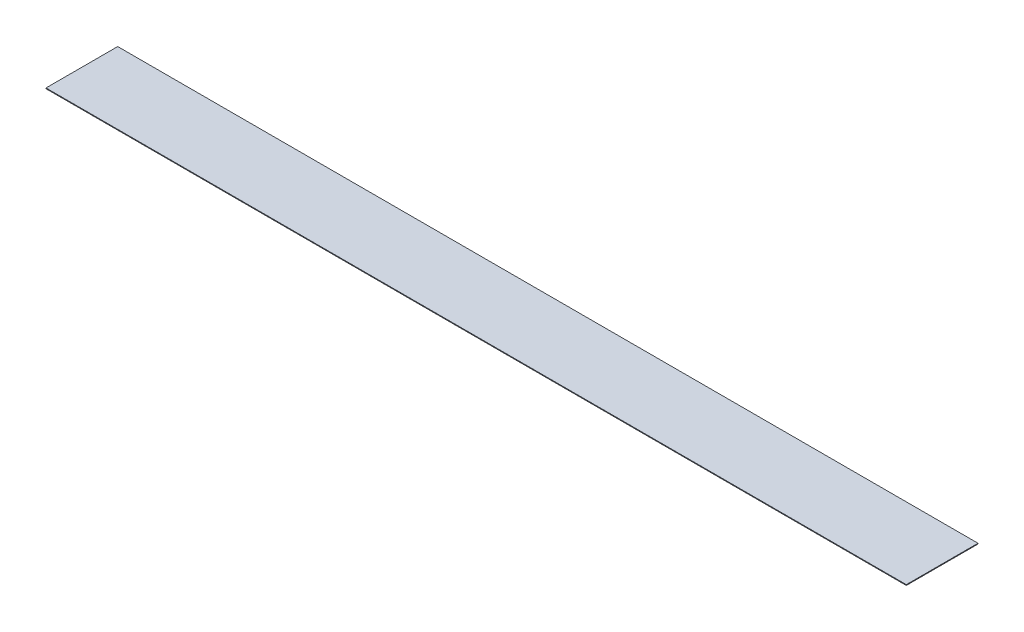
ISO-10303-21;
HEADER;
FILE_DESCRIPTION(('STEP AP214'),'2;1');
FILE_NAME('part.step','',(''),(''),'','','');
FILE_SCHEMA(('AUTOMOTIVE_DESIGN { 1 0 10303 214 1 1 1 1 }'));
ENDSEC;
DATA;
#1=APPLICATION_CONTEXT('core data for automotive mechanical design processes');
#2=APPLICATION_PROTOCOL_DEFINITION('international standard','automotive_design',2000,#1);
#3=PRODUCT_CONTEXT('',#1,'mechanical');
#4=PRODUCT('Part','Part','',(#3));
#5=PRODUCT_RELATED_PRODUCT_CATEGORY('part','',(#4));
#6=PRODUCT_DEFINITION_FORMATION('','',#4);
#7=PRODUCT_DEFINITION_CONTEXT('part definition',#1,'design');
#8=PRODUCT_DEFINITION('design','',#6,#7);
#9=PRODUCT_DEFINITION_SHAPE('','',#8);
#10=(LENGTH_UNIT() NAMED_UNIT(*) SI_UNIT(.MILLI.,.METRE.));
#11=(NAMED_UNIT(*) PLANE_ANGLE_UNIT() SI_UNIT($,.RADIAN.));
#12=(NAMED_UNIT(*) SI_UNIT($,.STERADIAN.) SOLID_ANGLE_UNIT());
#13=UNCERTAINTY_MEASURE_WITH_UNIT(LENGTH_MEASURE(1.E-05),#10,'distance_accuracy_value','');
#14=(GEOMETRIC_REPRESENTATION_CONTEXT(3) GLOBAL_UNCERTAINTY_ASSIGNED_CONTEXT((#13)) GLOBAL_UNIT_ASSIGNED_CONTEXT((#10,
#11,#12)) REPRESENTATION_CONTEXT('',''));
#15=CARTESIAN_POINT('',(0.,0.,0.));
#16=DIRECTION('',(0.,0.,1.));
#17=DIRECTION('',(1.,0.,0.));
#18=AXIS2_PLACEMENT_3D('',#15,#16,#17);
#19=CARTESIAN_POINT('',(1524.,2.54,127.));
#20=DIRECTION('',(-1.,0.,0.));
#21=DIRECTION('',(0.,0.,1.));
#22=AXIS2_PLACEMENT_3D('',#19,#20,#21);
#23=PLANE('',#22);
#24=DIRECTION('',(0.,0.,-1.));
#25=VECTOR('',#24,1.);
#26=CARTESIAN_POINT('',(1524.,0.,127.));
#27=LINE('',#26,#25);
#28=CARTESIAN_POINT('',(1524.,0.,127.));
#29=VERTEX_POINT('',#28);
#30=CARTESIAN_POINT('',(1524.,0.,-127.));
#31=VERTEX_POINT('',#30);
#32=EDGE_CURVE('E107',#29,#31,#27,.T.);
#33=ORIENTED_EDGE('',*,*,#32,.T.);
#34=DIRECTION('',(0.,-1.,0.));
#35=VECTOR('',#34,1.);
#36=CARTESIAN_POINT('',(1524.,2.54,-127.));
#37=LINE('',#36,#35);
#38=CARTESIAN_POINT('',(1524.,2.54,-127.));
#39=VERTEX_POINT('',#38);
#40=EDGE_CURVE('E11',#39,#31,#37,.T.);
#41=ORIENTED_EDGE('',*,*,#40,.F.);
#42=DIRECTION('',(0.,0.,-1.));
#43=VECTOR('',#42,1.);
#44=CARTESIAN_POINT('',(1524.,2.54,127.));
#45=LINE('',#44,#43);
#46=CARTESIAN_POINT('',(1524.,2.54,127.));
#47=VERTEX_POINT('',#46);
#48=EDGE_CURVE('E91',#47,#39,#45,.T.);
#49=ORIENTED_EDGE('',*,*,#48,.F.);
#50=DIRECTION('',(0.,-1.,0.));
#51=VECTOR('',#50,1.);
#52=CARTESIAN_POINT('',(1524.,2.54,127.));
#53=LINE('',#52,#51);
#54=EDGE_CURVE('E103',#47,#29,#53,.T.);
#55=ORIENTED_EDGE('',*,*,#54,.T.);
#56=EDGE_LOOP('',(#33,#41,#49,#55));
#57=FACE_BOUND('',#56,.T.);
#58=ADVANCED_FACE('F39',(#57),#23,.F.);
#59=CARTESIAN_POINT('',(-1524.,2.54,-127.));
#60=DIRECTION('',(0.,0.,1.));
#61=DIRECTION('',(1.,0.,0.));
#62=AXIS2_PLACEMENT_3D('',#59,#60,#61);
#63=PLANE('',#62);
#64=DIRECTION('',(-1.,0.,0.));
#65=VECTOR('',#64,1.);
#66=CARTESIAN_POINT('',(-1524.,0.,-127.));
#67=LINE('',#66,#65);
#68=CARTESIAN_POINT('',(-1524.,0.,-127.));
#69=VERTEX_POINT('',#68);
#70=EDGE_CURVE('E96',#31,#69,#67,.T.);
#71=ORIENTED_EDGE('',*,*,#70,.T.);
#72=DIRECTION('',(0.,-1.,0.));
#73=VECTOR('',#72,1.);
#74=CARTESIAN_POINT('',(-1524.,2.54,-127.));
#75=LINE('',#74,#73);
#76=CARTESIAN_POINT('',(-1524.,2.54,-127.));
#77=VERTEX_POINT('',#76);
#78=EDGE_CURVE('E48',#77,#69,#75,.T.);
#79=ORIENTED_EDGE('',*,*,#78,.F.);
#80=DIRECTION('',(-1.,0.,0.));
#81=VECTOR('',#80,1.);
#82=CARTESIAN_POINT('',(-1524.,2.54,-127.));
#83=LINE('',#82,#81);
#84=EDGE_CURVE('E86',#39,#77,#83,.T.);
#85=ORIENTED_EDGE('',*,*,#84,.F.);
#86=ORIENTED_EDGE('',*,*,#40,.T.);
#87=EDGE_LOOP('',(#71,#79,#85,#86));
#88=FACE_BOUND('',#87,.T.);
#89=ADVANCED_FACE('F95',(#88),#63,.F.);
#90=CARTESIAN_POINT('',(-1524.,2.54,127.));
#91=DIRECTION('',(1.,0.,0.));
#92=DIRECTION('',(0.,0.,-1.));
#93=AXIS2_PLACEMENT_3D('',#90,#91,#92);
#94=PLANE('',#93);
#95=DIRECTION('',(0.,0.,1.));
#96=VECTOR('',#95,1.);
#97=CARTESIAN_POINT('',(-1524.,0.,127.));
#98=LINE('',#97,#96);
#99=CARTESIAN_POINT('',(-1524.,0.,127.));
#100=VERTEX_POINT('',#99);
#101=EDGE_CURVE('E73',#69,#100,#98,.T.);
#102=ORIENTED_EDGE('',*,*,#101,.T.);
#103=DIRECTION('',(0.,-1.,0.));
#104=VECTOR('',#103,1.);
#105=CARTESIAN_POINT('',(-1524.,2.54,127.));
#106=LINE('',#105,#104);
#107=CARTESIAN_POINT('',(-1524.,2.54,127.));
#108=VERTEX_POINT('',#107);
#109=EDGE_CURVE('E98',#108,#100,#106,.T.);
#110=ORIENTED_EDGE('',*,*,#109,.F.);
#111=DIRECTION('',(0.,0.,1.));
#112=VECTOR('',#111,1.);
#113=CARTESIAN_POINT('',(-1524.,2.54,127.));
#114=LINE('',#113,#112);
#115=EDGE_CURVE('E89',#77,#108,#114,.T.);
#116=ORIENTED_EDGE('',*,*,#115,.F.);
#117=ORIENTED_EDGE('',*,*,#78,.T.);
#118=EDGE_LOOP('',(#102,#110,#116,#117));
#119=FACE_BOUND('',#118,.T.);
#120=ADVANCED_FACE('F99',(#119),#94,.F.);
#121=CARTESIAN_POINT('',(-1524.,2.54,127.));
#122=DIRECTION('',(0.,0.,-1.));
#123=DIRECTION('',(-1.,0.,0.));
#124=AXIS2_PLACEMENT_3D('',#121,#122,#123);
#125=PLANE('',#124);
#126=DIRECTION('',(1.,0.,0.));
#127=VECTOR('',#126,1.);
#128=CARTESIAN_POINT('',(-1524.,0.,127.));
#129=LINE('',#128,#127);
#130=EDGE_CURVE('E79',#100,#29,#129,.T.);
#131=ORIENTED_EDGE('',*,*,#130,.T.);
#132=ORIENTED_EDGE('',*,*,#54,.F.);
#133=DIRECTION('',(1.,0.,0.));
#134=VECTOR('',#133,1.);
#135=CARTESIAN_POINT('',(-1524.,2.54,127.));
#136=LINE('',#135,#134);
#137=EDGE_CURVE('E56',#108,#47,#136,.T.);
#138=ORIENTED_EDGE('',*,*,#137,.F.);
#139=ORIENTED_EDGE('',*,*,#109,.T.);
#140=EDGE_LOOP('',(#131,#132,#138,#139));
#141=FACE_BOUND('',#140,.T.);
#142=ADVANCED_FACE('F120',(#141),#125,.F.);
#143=CARTESIAN_POINT('',(0.,2.54,0.));
#144=DIRECTION('',(0.,-1.,0.));
#145=DIRECTION('',(0.,0.,-1.));
#146=AXIS2_PLACEMENT_3D('',#143,#144,#145);
#147=PLANE('',#146);
#148=ORIENTED_EDGE('',*,*,#48,.T.);
#149=ORIENTED_EDGE('',*,*,#84,.T.);
#150=ORIENTED_EDGE('',*,*,#115,.T.);
#151=ORIENTED_EDGE('',*,*,#137,.T.);
#152=EDGE_LOOP('',(#148,#149,#150,#151));
#153=FACE_BOUND('',#152,.T.);
#154=ADVANCED_FACE('F87',(#153),#147,.F.);
#155=CARTESIAN_POINT('',(0.,0.,0.));
#156=DIRECTION('',(0.,-1.,0.));
#157=DIRECTION('',(0.,0.,-1.));
#158=AXIS2_PLACEMENT_3D('',#155,#156,#157);
#159=PLANE('',#158);
#160=ORIENTED_EDGE('',*,*,#32,.F.);
#161=ORIENTED_EDGE('',*,*,#130,.F.);
#162=ORIENTED_EDGE('',*,*,#101,.F.);
#163=ORIENTED_EDGE('',*,*,#70,.F.);
#164=EDGE_LOOP('',(#160,#161,#162,#163));
#165=FACE_BOUND('',#164,.T.);
#166=ADVANCED_FACE('F123',(#165),#159,.T.);
#167=CLOSED_SHELL('',(#58,#89,#120,#142,#154,#166));
#168=MANIFOLD_SOLID_BREP('B2',#167);
#169=ADVANCED_BREP_SHAPE_REPRESENTATION('',(#18,#168),#14);
#170=SHAPE_DEFINITION_REPRESENTATION(#9,#169);
ENDSEC;
END-ISO-10303-21;
